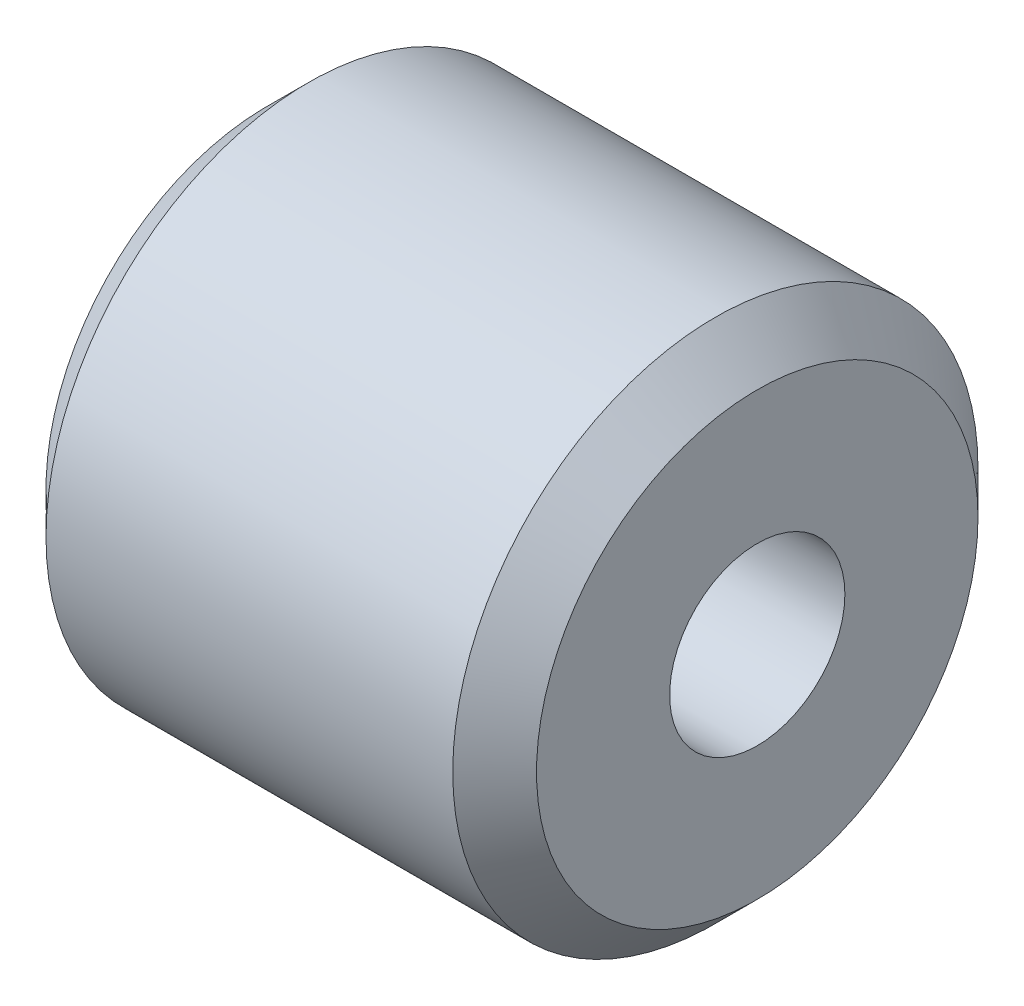
ISO-10303-21;
HEADER;
FILE_DESCRIPTION(('STEP AP214'),'2;1');
FILE_NAME('part.step','',(''),(''),'','','');
FILE_SCHEMA(('AUTOMOTIVE_DESIGN { 1 0 10303 214 1 1 1 1 }'));
ENDSEC;
DATA;
#1=APPLICATION_CONTEXT('core data for automotive mechanical design processes');
#2=APPLICATION_PROTOCOL_DEFINITION('international standard','automotive_design',2000,#1);
#3=PRODUCT_CONTEXT('',#1,'mechanical');
#4=PRODUCT('Part','Part','',(#3));
#5=PRODUCT_RELATED_PRODUCT_CATEGORY('part','',(#4));
#6=PRODUCT_DEFINITION_FORMATION('','',#4);
#7=PRODUCT_DEFINITION_CONTEXT('part definition',#1,'design');
#8=PRODUCT_DEFINITION('design','',#6,#7);
#9=PRODUCT_DEFINITION_SHAPE('','',#8);
#10=(LENGTH_UNIT() NAMED_UNIT(*) SI_UNIT(.MILLI.,.METRE.));
#11=(NAMED_UNIT(*) PLANE_ANGLE_UNIT() SI_UNIT($,.RADIAN.));
#12=(NAMED_UNIT(*) SI_UNIT($,.STERADIAN.) SOLID_ANGLE_UNIT());
#13=UNCERTAINTY_MEASURE_WITH_UNIT(LENGTH_MEASURE(1.E-05),#10,'distance_accuracy_value','');
#14=(GEOMETRIC_REPRESENTATION_CONTEXT(3) GLOBAL_UNCERTAINTY_ASSIGNED_CONTEXT((#13)) GLOBAL_UNIT_ASSIGNED_CONTEXT((#10,
#11,#12)) REPRESENTATION_CONTEXT('',''));
#15=CARTESIAN_POINT('',(0.,0.,0.));
#16=DIRECTION('',(0.,0.,1.));
#17=DIRECTION('',(1.,0.,0.));
#18=AXIS2_PLACEMENT_3D('',#15,#16,#17);
#19=CARTESIAN_POINT('',(4.45,0.,0.));
#20=DIRECTION('',(1.,0.,0.));
#21=DIRECTION('',(0.,0.,-1.));
#22=AXIS2_PLACEMENT_3D('',#19,#20,#21);
#23=PLANE('',#22);
#24=CARTESIAN_POINT('',(4.45,0.,0.));
#25=DIRECTION('',(1.,0.,0.));
#26=DIRECTION('',(0.,0.,-1.));
#27=AXIS2_PLACEMENT_3D('',#24,#25,#26);
#28=CIRCLE('',#27,4.005);
#29=CARTESIAN_POINT('',(4.45,0.,-4.005));
#30=VERTEX_POINT('',#29);
#31=EDGE_CURVE('E10',#30,#30,#28,.T.);
#32=ORIENTED_EDGE('',*,*,#31,.T.);
#33=EDGE_LOOP('',(#32));
#34=FACE_BOUND('',#33,.T.);
#35=CARTESIAN_POINT('',(4.45,0.,0.));
#36=DIRECTION('',(1.,0.,0.));
#37=DIRECTION('',(0.,0.,-1.));
#38=AXIS2_PLACEMENT_3D('',#35,#36,#37);
#39=CIRCLE('',#38,1.59);
#40=CARTESIAN_POINT('',(4.45,0.,-1.59));
#41=VERTEX_POINT('',#40);
#42=EDGE_CURVE('E50',#41,#41,#39,.T.);
#43=ORIENTED_EDGE('',*,*,#42,.F.);
#44=EDGE_LOOP('',(#43));
#45=FACE_BOUND('',#44,.T.);
#46=ADVANCED_FACE('F30',(#34,#45),#23,.T.);
#47=CARTESIAN_POINT('',(-4.45,0.,0.));
#48=DIRECTION('',(1.,0.,0.));
#49=DIRECTION('',(0.,0.,-1.));
#50=AXIS2_PLACEMENT_3D('',#47,#48,#49);
#51=PLANE('',#50);
#52=CARTESIAN_POINT('',(-4.45,0.,0.));
#53=DIRECTION('',(1.,0.,0.));
#54=DIRECTION('',(0.,0.,-1.));
#55=AXIS2_PLACEMENT_3D('',#52,#53,#54);
#56=CIRCLE('',#55,4.00499999999999);
#57=CARTESIAN_POINT('',(-4.45,0.,-4.00499999999999));
#58=VERTEX_POINT('',#57);
#59=EDGE_CURVE('E37',#58,#58,#56,.F.);
#60=ORIENTED_EDGE('',*,*,#59,.T.);
#61=EDGE_LOOP('',(#60));
#62=FACE_BOUND('',#61,.T.);
#63=CARTESIAN_POINT('',(-4.45,0.,0.));
#64=DIRECTION('',(1.,0.,0.));
#65=DIRECTION('',(0.,0.,-1.));
#66=AXIS2_PLACEMENT_3D('',#63,#64,#65);
#67=CIRCLE('',#66,1.59);
#68=CARTESIAN_POINT('',(-4.45,0.,-1.59));
#69=VERTEX_POINT('',#68);
#70=EDGE_CURVE('E51',#69,#69,#67,.T.);
#71=ORIENTED_EDGE('',*,*,#70,.T.);
#72=EDGE_LOOP('',(#71));
#73=FACE_BOUND('',#72,.T.);
#74=ADVANCED_FACE('F61',(#62,#73),#51,.F.);
#75=CARTESIAN_POINT('',(4.45,0.,0.));
#76=DIRECTION('',(-1.,0.,0.));
#77=DIRECTION('',(0.,0.,1.));
#78=AXIS2_PLACEMENT_3D('',#75,#76,#77);
#79=CYLINDRICAL_SURFACE('',#78,4.765);
#80=CARTESIAN_POINT('',(-3.69,0.,0.));
#81=DIRECTION('',(1.,0.,0.));
#82=DIRECTION('',(0.,0.,-1.));
#83=AXIS2_PLACEMENT_3D('',#80,#81,#82);
#84=CIRCLE('',#83,4.765);
#85=CARTESIAN_POINT('',(-3.69,0.,-4.765));
#86=VERTEX_POINT('',#85);
#87=EDGE_CURVE('E41',#86,#86,#84,.T.);
#88=ORIENTED_EDGE('',*,*,#87,.T.);
#89=EDGE_LOOP('',(#88));
#90=FACE_BOUND('',#89,.T.);
#91=CARTESIAN_POINT('',(3.69,0.,0.));
#92=DIRECTION('',(1.,0.,0.));
#93=DIRECTION('',(0.,0.,-1.));
#94=AXIS2_PLACEMENT_3D('',#91,#92,#93);
#95=CIRCLE('',#94,4.765);
#96=CARTESIAN_POINT('',(3.69,0.,-4.765));
#97=VERTEX_POINT('',#96);
#98=EDGE_CURVE('E45',#97,#97,#95,.F.);
#99=ORIENTED_EDGE('',*,*,#98,.T.);
#100=EDGE_LOOP('',(#99));
#101=FACE_BOUND('',#100,.T.);
#102=ADVANCED_FACE('F66',(#90,#101),#79,.T.);
#103=CARTESIAN_POINT('',(4.45,0.,0.));
#104=DIRECTION('',(-1.,0.,0.));
#105=DIRECTION('',(0.,0.,1.));
#106=AXIS2_PLACEMENT_3D('',#103,#104,#105);
#107=CYLINDRICAL_SURFACE('',#106,1.59);
#108=ORIENTED_EDGE('',*,*,#42,.T.);
#109=EDGE_LOOP('',(#108));
#110=FACE_BOUND('',#109,.T.);
#111=ORIENTED_EDGE('',*,*,#70,.F.);
#112=EDGE_LOOP('',(#111));
#113=FACE_BOUND('',#112,.T.);
#114=ADVANCED_FACE('F57',(#110,#113),#107,.F.);
#115=CARTESIAN_POINT('',(-3.69,0.,0.));
#116=DIRECTION('',(1.,0.,0.));
#117=DIRECTION('',(0.,0.,-1.));
#118=AXIS2_PLACEMENT_3D('',#115,#116,#117);
#119=CONICAL_SURFACE('',#118,4.765,0.78539816339745);
#120=ORIENTED_EDGE('',*,*,#59,.F.);
#121=EDGE_LOOP('',(#120));
#122=FACE_BOUND('',#121,.T.);
#123=ORIENTED_EDGE('',*,*,#87,.F.);
#124=EDGE_LOOP('',(#123));
#125=FACE_BOUND('',#124,.T.);
#126=ADVANCED_FACE('F72',(#122,#125),#119,.T.);
#127=CARTESIAN_POINT('',(4.45,0.,0.));
#128=DIRECTION('',(-1.,0.,0.));
#129=DIRECTION('',(0.,0.,1.));
#130=AXIS2_PLACEMENT_3D('',#127,#128,#129);
#131=CONICAL_SURFACE('',#130,4.005,0.785398163397447);
#132=ORIENTED_EDGE('',*,*,#98,.F.);
#133=EDGE_LOOP('',(#132));
#134=FACE_BOUND('',#133,.T.);
#135=ORIENTED_EDGE('',*,*,#31,.F.);
#136=EDGE_LOOP('',(#135));
#137=FACE_BOUND('',#136,.T.);
#138=ADVANCED_FACE('F32',(#134,#137),#131,.T.);
#139=CLOSED_SHELL('',(#46,#74,#102,#114,#126,#138));
#140=MANIFOLD_SOLID_BREP('B2',#139);
#141=ADVANCED_BREP_SHAPE_REPRESENTATION('',(#18,#140),#14);
#142=SHAPE_DEFINITION_REPRESENTATION(#9,#141);
ENDSEC;
END-ISO-10303-21;
